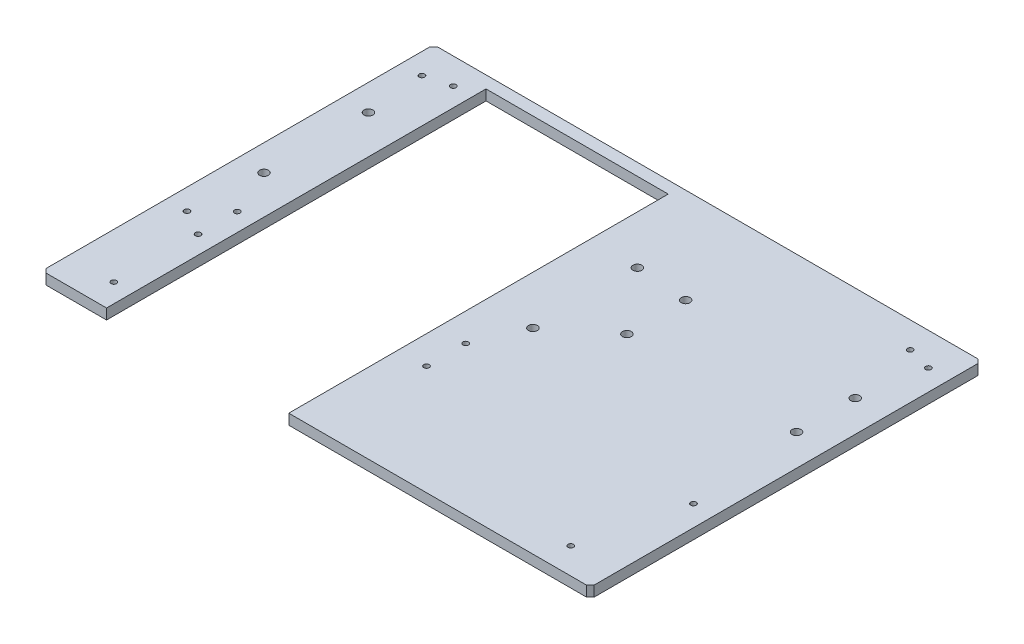
ISO-10303-21;
HEADER;
FILE_DESCRIPTION(('STEP AP214'),'2;1');
FILE_NAME('part.step','',(''),(''),'','','');
FILE_SCHEMA(('AUTOMOTIVE_DESIGN { 1 0 10303 214 1 1 1 1 }'));
ENDSEC;
DATA;
#1=APPLICATION_CONTEXT('core data for automotive mechanical design processes');
#2=APPLICATION_PROTOCOL_DEFINITION('international standard','automotive_design',2000,#1);
#3=PRODUCT_CONTEXT('',#1,'mechanical');
#4=PRODUCT('Part','Part','',(#3));
#5=PRODUCT_RELATED_PRODUCT_CATEGORY('part','',(#4));
#6=PRODUCT_DEFINITION_FORMATION('','',#4);
#7=PRODUCT_DEFINITION_CONTEXT('part definition',#1,'design');
#8=PRODUCT_DEFINITION('design','',#6,#7);
#9=PRODUCT_DEFINITION_SHAPE('','',#8);
#10=(LENGTH_UNIT() NAMED_UNIT(*) SI_UNIT(.MILLI.,.METRE.));
#11=(NAMED_UNIT(*) PLANE_ANGLE_UNIT() SI_UNIT($,.RADIAN.));
#12=(NAMED_UNIT(*) SI_UNIT($,.STERADIAN.) SOLID_ANGLE_UNIT());
#13=UNCERTAINTY_MEASURE_WITH_UNIT(LENGTH_MEASURE(1.E-05),#10,'distance_accuracy_value','');
#14=(GEOMETRIC_REPRESENTATION_CONTEXT(3) GLOBAL_UNCERTAINTY_ASSIGNED_CONTEXT((#13)) GLOBAL_UNIT_ASSIGNED_CONTEXT((#10,
#11,#12)) REPRESENTATION_CONTEXT('',''));
#15=CARTESIAN_POINT('',(0.,0.,0.));
#16=DIRECTION('',(0.,0.,1.));
#17=DIRECTION('',(1.,0.,0.));
#18=AXIS2_PLACEMENT_3D('',#15,#16,#17);
#19=CARTESIAN_POINT('',(-210.,4.,150.));
#20=DIRECTION('',(0.,0.,-1.));
#21=DIRECTION('',(-1.,0.,0.));
#22=AXIS2_PLACEMENT_3D('',#19,#20,#21);
#23=PLANE('',#22);
#24=DIRECTION('',(1.,0.,0.));
#25=VECTOR('',#24,1.);
#26=CARTESIAN_POINT('',(-210.,-4.,150.));
#27=LINE('',#26,#25);
#28=CARTESIAN_POINT('',(-207.,-4.,150.));
#29=VERTEX_POINT('',#28);
#30=CARTESIAN_POINT('',(-160.609555765265,-4.,150.));
#31=VERTEX_POINT('',#30);
#32=EDGE_CURVE('E305',#29,#31,#27,.T.);
#33=ORIENTED_EDGE('',*,*,#32,.T.);
#34=DIRECTION('',(0.,1.,0.));
#35=VECTOR('',#34,1.);
#36=CARTESIAN_POINT('',(-160.609555765265,4.,150.));
#37=LINE('',#36,#35);
#38=CARTESIAN_POINT('',(-160.609555765265,4.,150.));
#39=VERTEX_POINT('',#38);
#40=EDGE_CURVE('E156',#31,#39,#37,.T.);
#41=ORIENTED_EDGE('',*,*,#40,.T.);
#42=DIRECTION('',(1.,0.,0.));
#43=VECTOR('',#42,1.);
#44=CARTESIAN_POINT('',(-210.,4.,150.));
#45=LINE('',#44,#43);
#46=CARTESIAN_POINT('',(-207.,4.,150.));
#47=VERTEX_POINT('',#46);
#48=EDGE_CURVE('E313',#47,#39,#45,.T.);
#49=ORIENTED_EDGE('',*,*,#48,.F.);
#50=DIRECTION('',(0.,-1.,0.));
#51=VECTOR('',#50,1.);
#52=CARTESIAN_POINT('',(-207.,4.,150.));
#53=LINE('',#52,#51);
#54=EDGE_CURVE('E373',#47,#29,#53,.T.);
#55=ORIENTED_EDGE('',*,*,#54,.T.);
#56=EDGE_LOOP('',(#33,#41,#49,#55));
#57=FACE_BOUND('',#56,.T.);
#58=ADVANCED_FACE('F40',(#57),#23,.F.);
#59=CARTESIAN_POINT('',(210.,4.,150.));
#60=DIRECTION('',(-1.,0.,0.));
#61=DIRECTION('',(0.,0.,1.));
#62=AXIS2_PLACEMENT_3D('',#59,#60,#61);
#63=PLANE('',#62);
#64=DIRECTION('',(0.,0.,-1.));
#65=VECTOR('',#64,1.);
#66=CARTESIAN_POINT('',(210.,-4.,150.));
#67=LINE('',#66,#65);
#68=CARTESIAN_POINT('',(210.,-4.,147.));
#69=VERTEX_POINT('',#68);
#70=CARTESIAN_POINT('',(210.,-4.,-147.));
#71=VERTEX_POINT('',#70);
#72=EDGE_CURVE('E299',#69,#71,#67,.T.);
#73=ORIENTED_EDGE('',*,*,#72,.T.);
#74=DIRECTION('',(0.,1.,0.));
#75=VECTOR('',#74,1.);
#76=CARTESIAN_POINT('',(210.,4.,-147.));
#77=LINE('',#76,#75);
#78=CARTESIAN_POINT('',(210.,4.,-147.));
#79=VERTEX_POINT('',#78);
#80=EDGE_CURVE('E381',#71,#79,#77,.T.);
#81=ORIENTED_EDGE('',*,*,#80,.T.);
#82=DIRECTION('',(0.,0.,-1.));
#83=VECTOR('',#82,1.);
#84=CARTESIAN_POINT('',(210.,4.,150.));
#85=LINE('',#84,#83);
#86=CARTESIAN_POINT('',(210.,4.,147.));
#87=VERTEX_POINT('',#86);
#88=EDGE_CURVE('E300',#87,#79,#85,.T.);
#89=ORIENTED_EDGE('',*,*,#88,.F.);
#90=DIRECTION('',(0.,-1.,0.));
#91=VECTOR('',#90,1.);
#92=CARTESIAN_POINT('',(210.,4.,147.));
#93=LINE('',#92,#91);
#94=EDGE_CURVE('E377',#87,#69,#93,.T.);
#95=ORIENTED_EDGE('',*,*,#94,.T.);
#96=EDGE_LOOP('',(#73,#81,#89,#95));
#97=FACE_BOUND('',#96,.T.);
#98=ADVANCED_FACE('F425',(#97),#63,.F.);
#99=CARTESIAN_POINT('',(-210.,4.,-150.));
#100=DIRECTION('',(0.,0.,1.));
#101=DIRECTION('',(1.,0.,0.));
#102=AXIS2_PLACEMENT_3D('',#99,#100,#101);
#103=PLANE('',#102);
#104=DIRECTION('',(-1.,0.,0.));
#105=VECTOR('',#104,1.);
#106=CARTESIAN_POINT('',(-210.,-4.,-150.));
#107=LINE('',#106,#105);
#108=CARTESIAN_POINT('',(207.,-4.,-150.));
#109=VERTEX_POINT('',#108);
#110=CARTESIAN_POINT('',(-207.,-4.,-150.));
#111=VERTEX_POINT('',#110);
#112=EDGE_CURVE('E320',#109,#111,#107,.T.);
#113=ORIENTED_EDGE('',*,*,#112,.T.);
#114=DIRECTION('',(0.,1.,0.));
#115=VECTOR('',#114,1.);
#116=CARTESIAN_POINT('',(-207.,4.,-150.));
#117=LINE('',#116,#115);
#118=CARTESIAN_POINT('',(-207.,4.,-150.));
#119=VERTEX_POINT('',#118);
#120=EDGE_CURVE('E355',#111,#119,#117,.T.);
#121=ORIENTED_EDGE('',*,*,#120,.T.);
#122=DIRECTION('',(-1.,0.,0.));
#123=VECTOR('',#122,1.);
#124=CARTESIAN_POINT('',(-210.,4.,-150.));
#125=LINE('',#124,#123);
#126=CARTESIAN_POINT('',(207.,4.,-150.));
#127=VERTEX_POINT('',#126);
#128=EDGE_CURVE('E304',#127,#119,#125,.T.);
#129=ORIENTED_EDGE('',*,*,#128,.F.);
#130=DIRECTION('',(0.,-1.,0.));
#131=VECTOR('',#130,1.);
#132=CARTESIAN_POINT('',(207.,4.,-150.));
#133=LINE('',#132,#131);
#134=EDGE_CURVE('E351',#127,#109,#133,.T.);
#135=ORIENTED_EDGE('',*,*,#134,.T.);
#136=EDGE_LOOP('',(#113,#121,#129,#135));
#137=FACE_BOUND('',#136,.T.);
#138=ADVANCED_FACE('F433',(#137),#103,.F.);
#139=CARTESIAN_POINT('',(-210.,4.,150.));
#140=DIRECTION('',(1.,0.,0.));
#141=DIRECTION('',(0.,0.,-1.));
#142=AXIS2_PLACEMENT_3D('',#139,#140,#141);
#143=PLANE('',#142);
#144=DIRECTION('',(0.,0.,1.));
#145=VECTOR('',#144,1.);
#146=CARTESIAN_POINT('',(-210.,4.,150.));
#147=LINE('',#146,#145);
#148=CARTESIAN_POINT('',(-210.,4.,-147.));
#149=VERTEX_POINT('',#148);
#150=CARTESIAN_POINT('',(-210.,4.,147.));
#151=VERTEX_POINT('',#150);
#152=EDGE_CURVE('E309',#149,#151,#147,.T.);
#153=ORIENTED_EDGE('',*,*,#152,.F.);
#154=DIRECTION('',(0.,-1.,0.));
#155=VECTOR('',#154,1.);
#156=CARTESIAN_POINT('',(-210.,4.,-147.));
#157=LINE('',#156,#155);
#158=CARTESIAN_POINT('',(-210.,-4.,-147.));
#159=VERTEX_POINT('',#158);
#160=EDGE_CURVE('E334',#149,#159,#157,.T.);
#161=ORIENTED_EDGE('',*,*,#160,.T.);
#162=DIRECTION('',(0.,0.,1.));
#163=VECTOR('',#162,1.);
#164=CARTESIAN_POINT('',(-210.,-4.,150.));
#165=LINE('',#164,#163);
#166=CARTESIAN_POINT('',(-210.,-4.,147.));
#167=VERTEX_POINT('',#166);
#168=EDGE_CURVE('E324',#159,#167,#165,.T.);
#169=ORIENTED_EDGE('',*,*,#168,.T.);
#170=DIRECTION('',(0.,1.,0.));
#171=VECTOR('',#170,1.);
#172=CARTESIAN_POINT('',(-210.,4.,147.));
#173=LINE('',#172,#171);
#174=EDGE_CURVE('E316',#167,#151,#173,.T.);
#175=ORIENTED_EDGE('',*,*,#174,.T.);
#176=EDGE_LOOP('',(#153,#161,#169,#175));
#177=FACE_BOUND('',#176,.T.);
#178=ADVANCED_FACE('F442',(#177),#143,.F.);
#179=CARTESIAN_POINT('',(-21.0268777742826,4.,150.));
#180=VERTEX_POINT('',#179);
#181=CARTESIAN_POINT('',(207.,4.,150.));
#182=VERTEX_POINT('',#181);
#183=EDGE_CURVE('E64',#180,#182,#45,.T.);
#184=ORIENTED_EDGE('',*,*,#183,.F.);
#185=DIRECTION('',(0.,-1.,0.));
#186=VECTOR('',#185,1.);
#187=CARTESIAN_POINT('',(-21.0268777742826,4.,150.));
#188=LINE('',#187,#186);
#189=CARTESIAN_POINT('',(-21.0268777742826,-4.,150.));
#190=VERTEX_POINT('',#189);
#191=EDGE_CURVE('E142',#180,#190,#188,.T.);
#192=ORIENTED_EDGE('',*,*,#191,.T.);
#193=CARTESIAN_POINT('',(207.,-4.,150.));
#194=VERTEX_POINT('',#193);
#195=EDGE_CURVE('E328',#190,#194,#27,.T.);
#196=ORIENTED_EDGE('',*,*,#195,.T.);
#197=DIRECTION('',(0.,1.,0.));
#198=VECTOR('',#197,1.);
#199=CARTESIAN_POINT('',(207.,4.,150.));
#200=LINE('',#199,#198);
#201=EDGE_CURVE('E370',#194,#182,#200,.T.);
#202=ORIENTED_EDGE('',*,*,#201,.T.);
#203=EDGE_LOOP('',(#184,#192,#196,#202));
#204=FACE_BOUND('',#203,.T.);
#205=ADVANCED_FACE('F412',(#204),#23,.F.);
#206=CARTESIAN_POINT('',(210.,4.,-150.));
#207=DIRECTION('',(0.,-1.,0.));
#208=DIRECTION('',(0.,0.,-1.));
#209=AXIS2_PLACEMENT_3D('',#206,#207,#208);
#210=PLANE('',#209);
#211=CARTESIAN_POINT('',(-175.,4.,130.));
#212=DIRECTION('',(0.,1.,0.));
#213=DIRECTION('',(0.,0.,1.));
#214=AXIS2_PLACEMENT_3D('',#211,#212,#213);
#215=CIRCLE('',#214,2.09999999999999);
#216=CARTESIAN_POINT('',(-175.,4.,132.1));
#217=VERTEX_POINT('',#216);
#218=EDGE_CURVE('E160',#217,#217,#215,.T.);
#219=ORIENTED_EDGE('',*,*,#218,.F.);
#220=EDGE_LOOP('',(#219));
#221=FACE_BOUND('',#220,.T.);
#222=CARTESIAN_POINT('',(175.,4.,130.));
#223=DIRECTION('',(0.,1.,0.));
#224=DIRECTION('',(0.,0.,1.));
#225=AXIS2_PLACEMENT_3D('',#222,#223,#224);
#226=CIRCLE('',#225,2.09999999999999);
#227=CARTESIAN_POINT('',(175.,4.,132.1));
#228=VERTEX_POINT('',#227);
#229=EDGE_CURVE('E165',#228,#228,#226,.T.);
#230=ORIENTED_EDGE('',*,*,#229,.F.);
#231=EDGE_LOOP('',(#230));
#232=FACE_BOUND('',#231,.T.);
#233=CARTESIAN_POINT('',(175.,4.,-130.));
#234=DIRECTION('',(0.,1.,0.));
#235=DIRECTION('',(0.,0.,1.));
#236=AXIS2_PLACEMENT_3D('',#233,#234,#235);
#237=CIRCLE('',#236,2.09999999999999);
#238=CARTESIAN_POINT('',(175.,4.,-127.9));
#239=VERTEX_POINT('',#238);
#240=EDGE_CURVE('E173',#239,#239,#237,.T.);
#241=ORIENTED_EDGE('',*,*,#240,.F.);
#242=EDGE_LOOP('',(#241));
#243=FACE_BOUND('',#242,.T.);
#244=CARTESIAN_POINT('',(-175.,4.,-130.));
#245=DIRECTION('',(0.,1.,0.));
#246=DIRECTION('',(0.,0.,1.));
#247=AXIS2_PLACEMENT_3D('',#244,#245,#246);
#248=CIRCLE('',#247,2.09999999999999);
#249=CARTESIAN_POINT('',(-175.,4.,-127.9));
#250=VERTEX_POINT('',#249);
#251=EDGE_CURVE('E178',#250,#250,#248,.T.);
#252=ORIENTED_EDGE('',*,*,#251,.F.);
#253=EDGE_LOOP('',(#252));
#254=FACE_BOUND('',#253,.T.);
#255=CARTESIAN_POINT('',(-194.,4.,-125.));
#256=DIRECTION('',(0.,1.,0.));
#257=DIRECTION('',(0.,0.,1.));
#258=AXIS2_PLACEMENT_3D('',#255,#256,#257);
#259=CIRCLE('',#258,2.09999999999999);
#260=CARTESIAN_POINT('',(-194.,4.,-122.9));
#261=VERTEX_POINT('',#260);
#262=EDGE_CURVE('E183',#261,#261,#259,.T.);
#263=ORIENTED_EDGE('',*,*,#262,.F.);
#264=EDGE_LOOP('',(#263));
#265=FACE_BOUND('',#264,.T.);
#266=CARTESIAN_POINT('',(-194.,4.,54.9999999999999));
#267=DIRECTION('',(0.,1.,0.));
#268=DIRECTION('',(0.,0.,1.));
#269=AXIS2_PLACEMENT_3D('',#266,#267,#268);
#270=CIRCLE('',#269,2.09999999999999);
#271=CARTESIAN_POINT('',(-194.,4.,57.0999999999999));
#272=VERTEX_POINT('',#271);
#273=EDGE_CURVE('E191',#272,#272,#270,.T.);
#274=ORIENTED_EDGE('',*,*,#273,.F.);
#275=EDGE_LOOP('',(#274));
#276=FACE_BOUND('',#275,.T.);
#277=CARTESIAN_POINT('',(194.,4.,54.9999999999999));
#278=DIRECTION('',(0.,1.,0.));
#279=DIRECTION('',(0.,0.,1.));
#280=AXIS2_PLACEMENT_3D('',#277,#278,#279);
#281=CIRCLE('',#280,2.09999999999999);
#282=CARTESIAN_POINT('',(194.,4.,57.0999999999999));
#283=VERTEX_POINT('',#282);
#284=EDGE_CURVE('E196',#283,#283,#281,.T.);
#285=ORIENTED_EDGE('',*,*,#284,.F.);
#286=EDGE_LOOP('',(#285));
#287=FACE_BOUND('',#286,.T.);
#288=CARTESIAN_POINT('',(194.,4.,-125.));
#289=DIRECTION('',(0.,1.,0.));
#290=DIRECTION('',(0.,0.,1.));
#291=AXIS2_PLACEMENT_3D('',#288,#289,#290);
#292=CIRCLE('',#291,2.09999999999999);
#293=CARTESIAN_POINT('',(194.,4.,-122.9));
#294=VERTEX_POINT('',#293);
#295=EDGE_CURVE('E204',#294,#294,#292,.T.);
#296=ORIENTED_EDGE('',*,*,#295,.F.);
#297=EDGE_LOOP('',(#296));
#298=FACE_BOUND('',#297,.T.);
#299=CARTESIAN_POINT('',(-174.5,4.,66.0000000000001));
#300=DIRECTION('',(0.,1.,0.));
#301=DIRECTION('',(0.,0.,1.));
#302=AXIS2_PLACEMENT_3D('',#299,#300,#301);
#303=CIRCLE('',#302,2.09999999999999);
#304=CARTESIAN_POINT('',(-174.5,4.,68.1000000000001));
#305=VERTEX_POINT('',#304);
#306=EDGE_CURVE('E212',#305,#305,#303,.T.);
#307=ORIENTED_EDGE('',*,*,#306,.F.);
#308=EDGE_LOOP('',(#307));
#309=FACE_BOUND('',#308,.T.);
#310=CARTESIAN_POINT('',(-174.5,4.,36.0000000000001));
#311=DIRECTION('',(0.,1.,0.));
#312=DIRECTION('',(0.,0.,1.));
#313=AXIS2_PLACEMENT_3D('',#310,#311,#312);
#314=CIRCLE('',#313,2.09999999999999);
#315=CARTESIAN_POINT('',(-174.5,4.,38.1000000000001));
#316=VERTEX_POINT('',#315);
#317=EDGE_CURVE('E220',#316,#316,#314,.T.);
#318=ORIENTED_EDGE('',*,*,#317,.F.);
#319=EDGE_LOOP('',(#318));
#320=FACE_BOUND('',#319,.T.);
#321=CARTESIAN_POINT('',(0.499999999999751,4.,36.0000000000001));
#322=DIRECTION('',(0.,1.,0.));
#323=DIRECTION('',(0.,0.,1.));
#324=AXIS2_PLACEMENT_3D('',#321,#322,#323);
#325=CIRCLE('',#324,2.1);
#326=CARTESIAN_POINT('',(0.499999999999751,4.,38.1000000000001));
#327=VERTEX_POINT('',#326);
#328=EDGE_CURVE('E228',#327,#327,#325,.T.);
#329=ORIENTED_EDGE('',*,*,#328,.F.);
#330=EDGE_LOOP('',(#329));
#331=FACE_BOUND('',#330,.T.);
#332=CARTESIAN_POINT('',(0.499999999999862,4.,66.0000000000001));
#333=DIRECTION('',(0.,1.,0.));
#334=DIRECTION('',(0.,0.,1.));
#335=AXIS2_PLACEMENT_3D('',#332,#333,#334);
#336=CIRCLE('',#335,2.1);
#337=CARTESIAN_POINT('',(0.499999999999862,4.,68.1000000000001));
#338=VERTEX_POINT('',#337);
#339=EDGE_CURVE('E236',#338,#338,#336,.T.);
#340=ORIENTED_EDGE('',*,*,#339,.F.);
#341=EDGE_LOOP('',(#340));
#342=FACE_BOUND('',#341,.T.);
#343=CARTESIAN_POINT('',(-190.,4.,-80.0000000000001));
#344=DIRECTION('',(0.,1.,0.));
#345=DIRECTION('',(0.,0.,1.));
#346=AXIS2_PLACEMENT_3D('',#343,#344,#345);
#347=CIRCLE('',#346,3.39999999999999);
#348=CARTESIAN_POINT('',(-190.,4.,-76.6000000000001));
#349=VERTEX_POINT('',#348);
#350=EDGE_CURVE('E244',#349,#349,#347,.T.);
#351=ORIENTED_EDGE('',*,*,#350,.F.);
#352=EDGE_LOOP('',(#351));
#353=FACE_BOUND('',#352,.T.);
#354=CARTESIAN_POINT('',(15.9999999999998,4.,-80.0000000000001));
#355=DIRECTION('',(0.,1.,0.));
#356=DIRECTION('',(0.,0.,1.));
#357=AXIS2_PLACEMENT_3D('',#354,#355,#356);
#358=CIRCLE('',#357,3.39999999999999);
#359=CARTESIAN_POINT('',(15.9999999999998,4.,-76.6000000000001));
#360=VERTEX_POINT('',#359);
#361=EDGE_CURVE('E249',#360,#360,#358,.T.);
#362=ORIENTED_EDGE('',*,*,#361,.F.);
#363=EDGE_LOOP('',(#362));
#364=FACE_BOUND('',#363,.T.);
#365=CARTESIAN_POINT('',(16.0000000000001,4.,0.));
#366=DIRECTION('',(0.,1.,0.));
#367=DIRECTION('',(0.,0.,1.));
#368=AXIS2_PLACEMENT_3D('',#365,#366,#367);
#369=CIRCLE('',#368,3.39999999999999);
#370=CARTESIAN_POINT('',(16.0000000000001,4.,3.39999999999992));
#371=VERTEX_POINT('',#370);
#372=EDGE_CURVE('E254',#371,#371,#369,.T.);
#373=ORIENTED_EDGE('',*,*,#372,.F.);
#374=EDGE_LOOP('',(#373));
#375=FACE_BOUND('',#374,.T.);
#376=CARTESIAN_POINT('',(-190.,4.,0.));
#377=DIRECTION('',(0.,1.,0.));
#378=DIRECTION('',(0.,0.,1.));
#379=AXIS2_PLACEMENT_3D('',#376,#377,#378);
#380=CIRCLE('',#379,3.39999999999999);
#381=CARTESIAN_POINT('',(-190.,4.,3.39999999999992));
#382=VERTEX_POINT('',#381);
#383=EDGE_CURVE('E259',#382,#382,#380,.T.);
#384=ORIENTED_EDGE('',*,*,#383,.F.);
#385=EDGE_LOOP('',(#384));
#386=FACE_BOUND('',#385,.T.);
#387=CARTESIAN_POINT('',(56.,4.,-32.0000000000001));
#388=DIRECTION('',(0.,1.,0.));
#389=DIRECTION('',(0.,0.,1.));
#390=AXIS2_PLACEMENT_3D('',#387,#388,#389);
#391=CIRCLE('',#390,3.39999999999999);
#392=CARTESIAN_POINT('',(56.,4.,-28.6000000000001));
#393=VERTEX_POINT('',#392);
#394=EDGE_CURVE('E267',#393,#393,#391,.T.);
#395=ORIENTED_EDGE('',*,*,#394,.F.);
#396=EDGE_LOOP('',(#395));
#397=FACE_BOUND('',#396,.T.);
#398=CARTESIAN_POINT('',(186.,4.,-32.0000000000001));
#399=DIRECTION('',(0.,1.,0.));
#400=DIRECTION('',(0.,0.,1.));
#401=AXIS2_PLACEMENT_3D('',#398,#399,#400);
#402=CIRCLE('',#401,3.39999999999999);
#403=CARTESIAN_POINT('',(186.,4.,-28.6000000000001));
#404=VERTEX_POINT('',#403);
#405=EDGE_CURVE('E275',#404,#404,#402,.T.);
#406=ORIENTED_EDGE('',*,*,#405,.F.);
#407=EDGE_LOOP('',(#406));
#408=FACE_BOUND('',#407,.T.);
#409=CARTESIAN_POINT('',(186.,4.,-77.0000000000001));
#410=DIRECTION('',(0.,1.,0.));
#411=DIRECTION('',(0.,0.,1.));
#412=AXIS2_PLACEMENT_3D('',#409,#410,#411);
#413=CIRCLE('',#412,3.39999999999999);
#414=CARTESIAN_POINT('',(186.,4.,-73.6000000000001));
#415=VERTEX_POINT('',#414);
#416=EDGE_CURVE('E283',#415,#415,#413,.T.);
#417=ORIENTED_EDGE('',*,*,#416,.F.);
#418=EDGE_LOOP('',(#417));
#419=FACE_BOUND('',#418,.T.);
#420=CARTESIAN_POINT('',(56.,4.,-77.0000000000001));
#421=DIRECTION('',(0.,1.,0.));
#422=DIRECTION('',(0.,0.,1.));
#423=AXIS2_PLACEMENT_3D('',#420,#421,#422);
#424=CIRCLE('',#423,3.39999999999999);
#425=CARTESIAN_POINT('',(56.,4.,-73.6000000000001));
#426=VERTEX_POINT('',#425);
#427=EDGE_CURVE('E291',#426,#426,#424,.T.);
#428=ORIENTED_EDGE('',*,*,#427,.F.);
#429=EDGE_LOOP('',(#428));
#430=FACE_BOUND('',#429,.T.);
#431=ORIENTED_EDGE('',*,*,#48,.T.);
#432=DIRECTION('',(0.,0.,1.));
#433=VECTOR('',#432,1.);
#434=CARTESIAN_POINT('',(-160.609555765265,4.,-140.701128936423));
#435=LINE('',#434,#433);
#436=CARTESIAN_POINT('',(-160.609555765265,4.,-140.701128936423));
#437=VERTEX_POINT('',#436);
#438=EDGE_CURVE('E144',#437,#39,#435,.T.);
#439=ORIENTED_EDGE('',*,*,#438,.F.);
#440=DIRECTION('',(-1.,0.,0.));
#441=VECTOR('',#440,1.);
#442=CARTESIAN_POINT('',(-160.609555765265,4.,-140.701128936423));
#443=LINE('',#442,#441);
#444=CARTESIAN_POINT('',(-21.0268777742826,4.,-140.701128936423));
#445=VERTEX_POINT('',#444);
#446=EDGE_CURVE('E132',#445,#437,#443,.T.);
#447=ORIENTED_EDGE('',*,*,#446,.F.);
#448=DIRECTION('',(0.,0.,-1.));
#449=VECTOR('',#448,1.);
#450=CARTESIAN_POINT('',(-21.0268777742826,4.,-140.701128936423));
#451=LINE('',#450,#449);
#452=EDGE_CURVE('E139',#180,#445,#451,.T.);
#453=ORIENTED_EDGE('',*,*,#452,.F.);
#454=ORIENTED_EDGE('',*,*,#183,.T.);
#455=DIRECTION('',(-0.707106781186541,0.,0.707106781186554));
#456=VECTOR('',#455,1.);
#457=CARTESIAN_POINT('',(210.,4.,147.));
#458=LINE('',#457,#456);
#459=EDGE_CURVE('E358',#182,#87,#458,.F.);
#460=ORIENTED_EDGE('',*,*,#459,.T.);
#461=ORIENTED_EDGE('',*,*,#88,.T.);
#462=DIRECTION('',(0.707106781186554,0.,0.707106781186541));
#463=VECTOR('',#462,1.);
#464=CARTESIAN_POINT('',(207.,4.,-150.));
#465=LINE('',#464,#463);
#466=EDGE_CURVE('E361',#79,#127,#465,.F.);
#467=ORIENTED_EDGE('',*,*,#466,.T.);
#468=ORIENTED_EDGE('',*,*,#128,.T.);
#469=DIRECTION('',(0.707106781186541,0.,-0.707106781186554));
#470=VECTOR('',#469,1.);
#471=CARTESIAN_POINT('',(-210.,4.,-147.));
#472=LINE('',#471,#470);
#473=EDGE_CURVE('E367',#119,#149,#472,.F.);
#474=ORIENTED_EDGE('',*,*,#473,.T.);
#475=ORIENTED_EDGE('',*,*,#152,.T.);
#476=DIRECTION('',(-0.707106781186554,0.,-0.707106781186541));
#477=VECTOR('',#476,1.);
#478=CARTESIAN_POINT('',(-207.,4.,150.));
#479=LINE('',#478,#477);
#480=EDGE_CURVE('E364',#151,#47,#479,.F.);
#481=ORIENTED_EDGE('',*,*,#480,.T.);
#482=EDGE_LOOP('',(#431,#439,#447,#453,#454,#460,#461,#467,#468,#474,#475,#481));
#483=FACE_BOUND('',#482,.T.);
#484=ADVANCED_FACE('F147',(#221,#232,#243,#254,#265,#276,#287,#298,#309,#320,#331,#342,#353,
#364,#375,#386,#397,#408,#419,#430,#483),#210,.F.);
#485=CARTESIAN_POINT('',(210.,-4.,-150.));
#486=DIRECTION('',(0.,-1.,0.));
#487=DIRECTION('',(0.,0.,-1.));
#488=AXIS2_PLACEMENT_3D('',#485,#486,#487);
#489=PLANE('',#488);
#490=DIRECTION('',(0.,0.,-1.));
#491=VECTOR('',#490,1.);
#492=CARTESIAN_POINT('',(-160.609555765265,-4.,-150.));
#493=LINE('',#492,#491);
#494=CARTESIAN_POINT('',(-160.609555765265,-4.,-140.701128936423));
#495=VERTEX_POINT('',#494);
#496=EDGE_CURVE('E11',#31,#495,#493,.T.);
#497=ORIENTED_EDGE('',*,*,#496,.F.);
#498=ORIENTED_EDGE('',*,*,#32,.F.);
#499=DIRECTION('',(0.707106781186554,0.,0.707106781186541));
#500=VECTOR('',#499,1.);
#501=CARTESIAN_POINT('',(-148.499999999996,-4.,208.500000000003));
#502=LINE('',#501,#500);
#503=EDGE_CURVE('E345',#29,#167,#502,.F.);
#504=ORIENTED_EDGE('',*,*,#503,.T.);
#505=ORIENTED_EDGE('',*,*,#168,.F.);
#506=DIRECTION('',(-0.707106781186541,0.,0.707106781186554));
#507=VECTOR('',#506,1.);
#508=CARTESIAN_POINT('',(1.49999999999609,-4.,-358.5));
#509=LINE('',#508,#507);
#510=EDGE_CURVE('E348',#159,#111,#509,.F.);
#511=ORIENTED_EDGE('',*,*,#510,.T.);
#512=ORIENTED_EDGE('',*,*,#112,.F.);
#513=DIRECTION('',(-0.707106781186554,0.,-0.707106781186541));
#514=VECTOR('',#513,1.);
#515=CARTESIAN_POINT('',(208.5,-4.,-148.5));
#516=LINE('',#515,#514);
#517=EDGE_CURVE('E342',#109,#71,#516,.F.);
#518=ORIENTED_EDGE('',*,*,#517,.T.);
#519=ORIENTED_EDGE('',*,*,#72,.F.);
#520=DIRECTION('',(0.707106781186541,0.,-0.707106781186554));
#521=VECTOR('',#520,1.);
#522=CARTESIAN_POINT('',(358.5,-4.,-1.50000000000278));
#523=LINE('',#522,#521);
#524=EDGE_CURVE('E338',#69,#194,#523,.F.);
#525=ORIENTED_EDGE('',*,*,#524,.T.);
#526=ORIENTED_EDGE('',*,*,#195,.F.);
#527=DIRECTION('',(0.,0.,1.));
#528=VECTOR('',#527,1.);
#529=CARTESIAN_POINT('',(-21.0268777742826,-4.,-150.));
#530=LINE('',#529,#528);
#531=CARTESIAN_POINT('',(-21.0268777742826,-4.,-140.701128936423));
#532=VERTEX_POINT('',#531);
#533=EDGE_CURVE('E384',#532,#190,#530,.T.);
#534=ORIENTED_EDGE('',*,*,#533,.F.);
#535=DIRECTION('',(1.,0.,0.));
#536=VECTOR('',#535,1.);
#537=CARTESIAN_POINT('',(210.,-4.,-140.701128936423));
#538=LINE('',#537,#536);
#539=EDGE_CURVE('E49',#495,#532,#538,.T.);
#540=ORIENTED_EDGE('',*,*,#539,.F.);
#541=EDGE_LOOP('',(#497,#498,#504,#505,#511,#512,#518,#519,#525,#526,#534,#540));
#542=FACE_BOUND('',#541,.T.);
#543=CARTESIAN_POINT('',(-175.,-4.,130.));
#544=DIRECTION('',(0.,-1.,0.));
#545=DIRECTION('',(0.,0.,-1.));
#546=AXIS2_PLACEMENT_3D('',#543,#544,#545);
#547=CIRCLE('',#546,2.09999999999999);
#548=CARTESIAN_POINT('',(-175.,-4.,127.9));
#549=VERTEX_POINT('',#548);
#550=EDGE_CURVE('E164',#549,#549,#547,.T.);
#551=ORIENTED_EDGE('',*,*,#550,.F.);
#552=EDGE_LOOP('',(#551));
#553=FACE_BOUND('',#552,.T.);
#554=CARTESIAN_POINT('',(175.,-4.,130.));
#555=DIRECTION('',(0.,-1.,0.));
#556=DIRECTION('',(0.,0.,-1.));
#557=AXIS2_PLACEMENT_3D('',#554,#555,#556);
#558=CIRCLE('',#557,2.09999999999999);
#559=CARTESIAN_POINT('',(175.,-4.,127.9));
#560=VERTEX_POINT('',#559);
#561=EDGE_CURVE('E169',#560,#560,#558,.T.);
#562=ORIENTED_EDGE('',*,*,#561,.F.);
#563=EDGE_LOOP('',(#562));
#564=FACE_BOUND('',#563,.T.);
#565=CARTESIAN_POINT('',(175.,-4.,-130.));
#566=DIRECTION('',(0.,-1.,0.));
#567=DIRECTION('',(0.,0.,-1.));
#568=AXIS2_PLACEMENT_3D('',#565,#566,#567);
#569=CIRCLE('',#568,2.09999999999999);
#570=CARTESIAN_POINT('',(175.,-4.,-132.1));
#571=VERTEX_POINT('',#570);
#572=EDGE_CURVE('E177',#571,#571,#569,.T.);
#573=ORIENTED_EDGE('',*,*,#572,.F.);
#574=EDGE_LOOP('',(#573));
#575=FACE_BOUND('',#574,.T.);
#576=CARTESIAN_POINT('',(-175.,-4.,-130.));
#577=DIRECTION('',(0.,-1.,0.));
#578=DIRECTION('',(0.,0.,-1.));
#579=AXIS2_PLACEMENT_3D('',#576,#577,#578);
#580=CIRCLE('',#579,2.09999999999999);
#581=CARTESIAN_POINT('',(-175.,-4.,-132.1));
#582=VERTEX_POINT('',#581);
#583=EDGE_CURVE('E182',#582,#582,#580,.T.);
#584=ORIENTED_EDGE('',*,*,#583,.F.);
#585=EDGE_LOOP('',(#584));
#586=FACE_BOUND('',#585,.T.);
#587=CARTESIAN_POINT('',(-194.,-4.,-125.));
#588=DIRECTION('',(0.,-1.,0.));
#589=DIRECTION('',(0.,0.,-1.));
#590=AXIS2_PLACEMENT_3D('',#587,#588,#589);
#591=CIRCLE('',#590,2.09999999999999);
#592=CARTESIAN_POINT('',(-194.,-4.,-127.1));
#593=VERTEX_POINT('',#592);
#594=EDGE_CURVE('E187',#593,#593,#591,.T.);
#595=ORIENTED_EDGE('',*,*,#594,.F.);
#596=EDGE_LOOP('',(#595));
#597=FACE_BOUND('',#596,.T.);
#598=CARTESIAN_POINT('',(-194.,-4.,54.9999999999999));
#599=DIRECTION('',(0.,-1.,0.));
#600=DIRECTION('',(0.,0.,-1.));
#601=AXIS2_PLACEMENT_3D('',#598,#599,#600);
#602=CIRCLE('',#601,2.09999999999999);
#603=CARTESIAN_POINT('',(-194.,-4.,52.8999999999999));
#604=VERTEX_POINT('',#603);
#605=EDGE_CURVE('E195',#604,#604,#602,.T.);
#606=ORIENTED_EDGE('',*,*,#605,.F.);
#607=EDGE_LOOP('',(#606));
#608=FACE_BOUND('',#607,.T.);
#609=CARTESIAN_POINT('',(194.,-4.,54.9999999999999));
#610=DIRECTION('',(0.,-1.,0.));
#611=DIRECTION('',(0.,0.,-1.));
#612=AXIS2_PLACEMENT_3D('',#609,#610,#611);
#613=CIRCLE('',#612,2.09999999999999);
#614=CARTESIAN_POINT('',(194.,-4.,52.8999999999999));
#615=VERTEX_POINT('',#614);
#616=EDGE_CURVE('E200',#615,#615,#613,.T.);
#617=ORIENTED_EDGE('',*,*,#616,.F.);
#618=EDGE_LOOP('',(#617));
#619=FACE_BOUND('',#618,.T.);
#620=CARTESIAN_POINT('',(194.,-4.,-125.));
#621=DIRECTION('',(0.,-1.,0.));
#622=DIRECTION('',(0.,0.,-1.));
#623=AXIS2_PLACEMENT_3D('',#620,#621,#622);
#624=CIRCLE('',#623,2.09999999999999);
#625=CARTESIAN_POINT('',(194.,-4.,-127.1));
#626=VERTEX_POINT('',#625);
#627=EDGE_CURVE('E208',#626,#626,#624,.T.);
#628=ORIENTED_EDGE('',*,*,#627,.F.);
#629=EDGE_LOOP('',(#628));
#630=FACE_BOUND('',#629,.T.);
#631=CARTESIAN_POINT('',(-174.5,-4.,66.0000000000001));
#632=DIRECTION('',(0.,-1.,0.));
#633=DIRECTION('',(0.,0.,-1.));
#634=AXIS2_PLACEMENT_3D('',#631,#632,#633);
#635=CIRCLE('',#634,2.09999999999999);
#636=CARTESIAN_POINT('',(-174.5,-4.,63.9000000000001));
#637=VERTEX_POINT('',#636);
#638=EDGE_CURVE('E216',#637,#637,#635,.T.);
#639=ORIENTED_EDGE('',*,*,#638,.F.);
#640=EDGE_LOOP('',(#639));
#641=FACE_BOUND('',#640,.T.);
#642=CARTESIAN_POINT('',(-174.5,-4.,36.0000000000001));
#643=DIRECTION('',(0.,-1.,0.));
#644=DIRECTION('',(0.,0.,-1.));
#645=AXIS2_PLACEMENT_3D('',#642,#643,#644);
#646=CIRCLE('',#645,2.09999999999999);
#647=CARTESIAN_POINT('',(-174.5,-4.,33.9000000000001));
#648=VERTEX_POINT('',#647);
#649=EDGE_CURVE('E224',#648,#648,#646,.T.);
#650=ORIENTED_EDGE('',*,*,#649,.F.);
#651=EDGE_LOOP('',(#650));
#652=FACE_BOUND('',#651,.T.);
#653=CARTESIAN_POINT('',(0.499999999999751,-4.,36.0000000000001));
#654=DIRECTION('',(0.,-1.,0.));
#655=DIRECTION('',(0.,0.,-1.));
#656=AXIS2_PLACEMENT_3D('',#653,#654,#655);
#657=CIRCLE('',#656,2.1);
#658=CARTESIAN_POINT('',(0.499999999999751,-4.,33.9000000000001));
#659=VERTEX_POINT('',#658);
#660=EDGE_CURVE('E232',#659,#659,#657,.T.);
#661=ORIENTED_EDGE('',*,*,#660,.F.);
#662=EDGE_LOOP('',(#661));
#663=FACE_BOUND('',#662,.T.);
#664=CARTESIAN_POINT('',(0.499999999999862,-4.,66.0000000000001));
#665=DIRECTION('',(0.,-1.,0.));
#666=DIRECTION('',(0.,0.,-1.));
#667=AXIS2_PLACEMENT_3D('',#664,#665,#666);
#668=CIRCLE('',#667,2.1);
#669=CARTESIAN_POINT('',(0.499999999999862,-4.,63.9000000000001));
#670=VERTEX_POINT('',#669);
#671=EDGE_CURVE('E240',#670,#670,#668,.T.);
#672=ORIENTED_EDGE('',*,*,#671,.F.);
#673=EDGE_LOOP('',(#672));
#674=FACE_BOUND('',#673,.T.);
#675=CARTESIAN_POINT('',(-190.,-4.,-80.0000000000001));
#676=DIRECTION('',(0.,-1.,0.));
#677=DIRECTION('',(0.,0.,-1.));
#678=AXIS2_PLACEMENT_3D('',#675,#676,#677);
#679=CIRCLE('',#678,3.39999999999999);
#680=CARTESIAN_POINT('',(-190.,-4.,-83.4000000000001));
#681=VERTEX_POINT('',#680);
#682=EDGE_CURVE('E248',#681,#681,#679,.T.);
#683=ORIENTED_EDGE('',*,*,#682,.F.);
#684=EDGE_LOOP('',(#683));
#685=FACE_BOUND('',#684,.T.);
#686=CARTESIAN_POINT('',(15.9999999999998,-4.,-80.0000000000001));
#687=DIRECTION('',(0.,-1.,0.));
#688=DIRECTION('',(0.,0.,-1.));
#689=AXIS2_PLACEMENT_3D('',#686,#687,#688);
#690=CIRCLE('',#689,3.39999999999999);
#691=CARTESIAN_POINT('',(15.9999999999998,-4.,-83.4000000000001));
#692=VERTEX_POINT('',#691);
#693=EDGE_CURVE('E253',#692,#692,#690,.T.);
#694=ORIENTED_EDGE('',*,*,#693,.F.);
#695=EDGE_LOOP('',(#694));
#696=FACE_BOUND('',#695,.T.);
#697=CARTESIAN_POINT('',(16.0000000000001,-4.,0.));
#698=DIRECTION('',(0.,-1.,0.));
#699=DIRECTION('',(0.,0.,-1.));
#700=AXIS2_PLACEMENT_3D('',#697,#698,#699);
#701=CIRCLE('',#700,3.39999999999999);
#702=CARTESIAN_POINT('',(16.0000000000001,-4.,-3.40000000000006));
#703=VERTEX_POINT('',#702);
#704=EDGE_CURVE('E258',#703,#703,#701,.T.);
#705=ORIENTED_EDGE('',*,*,#704,.F.);
#706=EDGE_LOOP('',(#705));
#707=FACE_BOUND('',#706,.T.);
#708=CARTESIAN_POINT('',(-190.,-4.,0.));
#709=DIRECTION('',(0.,-1.,0.));
#710=DIRECTION('',(0.,0.,-1.));
#711=AXIS2_PLACEMENT_3D('',#708,#709,#710);
#712=CIRCLE('',#711,3.39999999999999);
#713=CARTESIAN_POINT('',(-190.,-4.,-3.40000000000006));
#714=VERTEX_POINT('',#713);
#715=EDGE_CURVE('E263',#714,#714,#712,.T.);
#716=ORIENTED_EDGE('',*,*,#715,.F.);
#717=EDGE_LOOP('',(#716));
#718=FACE_BOUND('',#717,.T.);
#719=CARTESIAN_POINT('',(56.,-4.,-32.0000000000001));
#720=DIRECTION('',(0.,-1.,0.));
#721=DIRECTION('',(0.,0.,-1.));
#722=AXIS2_PLACEMENT_3D('',#719,#720,#721);
#723=CIRCLE('',#722,3.39999999999999);
#724=CARTESIAN_POINT('',(56.,-4.,-35.4000000000001));
#725=VERTEX_POINT('',#724);
#726=EDGE_CURVE('E271',#725,#725,#723,.T.);
#727=ORIENTED_EDGE('',*,*,#726,.F.);
#728=EDGE_LOOP('',(#727));
#729=FACE_BOUND('',#728,.T.);
#730=CARTESIAN_POINT('',(186.,-4.,-32.0000000000001));
#731=DIRECTION('',(0.,-1.,0.));
#732=DIRECTION('',(0.,0.,-1.));
#733=AXIS2_PLACEMENT_3D('',#730,#731,#732);
#734=CIRCLE('',#733,3.39999999999999);
#735=CARTESIAN_POINT('',(186.,-4.,-35.4000000000001));
#736=VERTEX_POINT('',#735);
#737=EDGE_CURVE('E279',#736,#736,#734,.T.);
#738=ORIENTED_EDGE('',*,*,#737,.F.);
#739=EDGE_LOOP('',(#738));
#740=FACE_BOUND('',#739,.T.);
#741=CARTESIAN_POINT('',(186.,-4.,-77.0000000000001));
#742=DIRECTION('',(0.,-1.,0.));
#743=DIRECTION('',(0.,0.,-1.));
#744=AXIS2_PLACEMENT_3D('',#741,#742,#743);
#745=CIRCLE('',#744,3.39999999999999);
#746=CARTESIAN_POINT('',(186.,-4.,-80.4000000000001));
#747=VERTEX_POINT('',#746);
#748=EDGE_CURVE('E287',#747,#747,#745,.T.);
#749=ORIENTED_EDGE('',*,*,#748,.F.);
#750=EDGE_LOOP('',(#749));
#751=FACE_BOUND('',#750,.T.);
#752=CARTESIAN_POINT('',(56.,-4.,-77.0000000000001));
#753=DIRECTION('',(0.,-1.,0.));
#754=DIRECTION('',(0.,0.,-1.));
#755=AXIS2_PLACEMENT_3D('',#752,#753,#754);
#756=CIRCLE('',#755,3.39999999999999);
#757=CARTESIAN_POINT('',(56.,-4.,-80.4000000000001));
#758=VERTEX_POINT('',#757);
#759=EDGE_CURVE('E295',#758,#758,#756,.T.);
#760=ORIENTED_EDGE('',*,*,#759,.F.);
#761=EDGE_LOOP('',(#760));
#762=FACE_BOUND('',#761,.T.);
#763=ADVANCED_FACE('F418',(#542,#553,#564,#575,#586,#597,#608,#619,#630,#641,#652,#663,#674,
#685,#696,#707,#718,#729,#740,#751,#762),#489,.T.);
#764=CARTESIAN_POINT('',(-210.,4.,-147.));
#765=DIRECTION('',(0.707106781186554,0.,0.707106781186541));
#766=DIRECTION('',(0.707106781186541,0.,-0.707106781186554));
#767=AXIS2_PLACEMENT_3D('',#764,#765,#766);
#768=PLANE('',#767);
#769=ORIENTED_EDGE('',*,*,#473,.F.);
#770=ORIENTED_EDGE('',*,*,#120,.F.);
#771=ORIENTED_EDGE('',*,*,#510,.F.);
#772=ORIENTED_EDGE('',*,*,#160,.F.);
#773=EDGE_LOOP('',(#769,#770,#771,#772));
#774=FACE_BOUND('',#773,.T.);
#775=ADVANCED_FACE('F437',(#774),#768,.F.);
#776=CARTESIAN_POINT('',(-207.,4.,150.));
#777=DIRECTION('',(0.707106781186541,0.,-0.707106781186554));
#778=DIRECTION('',(-0.707106781186554,0.,-0.707106781186541));
#779=AXIS2_PLACEMENT_3D('',#776,#777,#778);
#780=PLANE('',#779);
#781=ORIENTED_EDGE('',*,*,#480,.F.);
#782=ORIENTED_EDGE('',*,*,#174,.F.);
#783=ORIENTED_EDGE('',*,*,#503,.F.);
#784=ORIENTED_EDGE('',*,*,#54,.F.);
#785=EDGE_LOOP('',(#781,#782,#783,#784));
#786=FACE_BOUND('',#785,.T.);
#787=ADVANCED_FACE('F446',(#786),#780,.F.);
#788=CARTESIAN_POINT('',(207.,4.,-150.));
#789=DIRECTION('',(-0.707106781186541,0.,0.707106781186554));
#790=DIRECTION('',(0.707106781186554,0.,0.707106781186541));
#791=AXIS2_PLACEMENT_3D('',#788,#789,#790);
#792=PLANE('',#791);
#793=ORIENTED_EDGE('',*,*,#466,.F.);
#794=ORIENTED_EDGE('',*,*,#80,.F.);
#795=ORIENTED_EDGE('',*,*,#517,.F.);
#796=ORIENTED_EDGE('',*,*,#134,.F.);
#797=EDGE_LOOP('',(#793,#794,#795,#796));
#798=FACE_BOUND('',#797,.T.);
#799=ADVANCED_FACE('F428',(#798),#792,.F.);
#800=CARTESIAN_POINT('',(210.,4.,147.));
#801=DIRECTION('',(-0.707106781186554,0.,-0.707106781186541));
#802=DIRECTION('',(-0.707106781186541,0.,0.707106781186554));
#803=AXIS2_PLACEMENT_3D('',#800,#801,#802);
#804=PLANE('',#803);
#805=ORIENTED_EDGE('',*,*,#459,.F.);
#806=ORIENTED_EDGE('',*,*,#201,.F.);
#807=ORIENTED_EDGE('',*,*,#524,.F.);
#808=ORIENTED_EDGE('',*,*,#94,.F.);
#809=EDGE_LOOP('',(#805,#806,#807,#808));
#810=FACE_BOUND('',#809,.T.);
#811=ADVANCED_FACE('F42',(#810),#804,.F.);
#812=CARTESIAN_POINT('',(56.,4.,-77.0000000000001));
#813=DIRECTION('',(0.,1.,0.));
#814=DIRECTION('',(0.,0.,1.));
#815=AXIS2_PLACEMENT_3D('',#812,#813,#814);
#816=CYLINDRICAL_SURFACE('',#815,3.39999999999999);
#817=ORIENTED_EDGE('',*,*,#759,.T.);
#818=EDGE_LOOP('',(#817));
#819=FACE_BOUND('',#818,.T.);
#820=ORIENTED_EDGE('',*,*,#427,.T.);
#821=EDGE_LOOP('',(#820));
#822=FACE_BOUND('',#821,.T.);
#823=ADVANCED_FACE('F494',(#819,#822),#816,.F.);
#824=CARTESIAN_POINT('',(186.,4.,-77.0000000000001));
#825=DIRECTION('',(0.,1.,0.));
#826=DIRECTION('',(0.,0.,1.));
#827=AXIS2_PLACEMENT_3D('',#824,#825,#826);
#828=CYLINDRICAL_SURFACE('',#827,3.39999999999999);
#829=ORIENTED_EDGE('',*,*,#748,.T.);
#830=EDGE_LOOP('',(#829));
#831=FACE_BOUND('',#830,.T.);
#832=ORIENTED_EDGE('',*,*,#416,.T.);
#833=EDGE_LOOP('',(#832));
#834=FACE_BOUND('',#833,.T.);
#835=ADVANCED_FACE('F498',(#831,#834),#828,.F.);
#836=CARTESIAN_POINT('',(186.,4.,-32.0000000000001));
#837=DIRECTION('',(0.,1.,0.));
#838=DIRECTION('',(0.,0.,1.));
#839=AXIS2_PLACEMENT_3D('',#836,#837,#838);
#840=CYLINDRICAL_SURFACE('',#839,3.39999999999999);
#841=ORIENTED_EDGE('',*,*,#737,.T.);
#842=EDGE_LOOP('',(#841));
#843=FACE_BOUND('',#842,.T.);
#844=ORIENTED_EDGE('',*,*,#405,.T.);
#845=EDGE_LOOP('',(#844));
#846=FACE_BOUND('',#845,.T.);
#847=ADVANCED_FACE('F504',(#843,#846),#840,.F.);
#848=CARTESIAN_POINT('',(56.,4.,-32.0000000000001));
#849=DIRECTION('',(0.,1.,0.));
#850=DIRECTION('',(0.,0.,1.));
#851=AXIS2_PLACEMENT_3D('',#848,#849,#850);
#852=CYLINDRICAL_SURFACE('',#851,3.39999999999999);
#853=ORIENTED_EDGE('',*,*,#726,.T.);
#854=EDGE_LOOP('',(#853));
#855=FACE_BOUND('',#854,.T.);
#856=ORIENTED_EDGE('',*,*,#394,.T.);
#857=EDGE_LOOP('',(#856));
#858=FACE_BOUND('',#857,.T.);
#859=ADVANCED_FACE('F688',(#855,#858),#852,.F.);
#860=CARTESIAN_POINT('',(-190.,4.,0.));
#861=DIRECTION('',(0.,1.,0.));
#862=DIRECTION('',(0.,0.,1.));
#863=AXIS2_PLACEMENT_3D('',#860,#861,#862);
#864=CYLINDRICAL_SURFACE('',#863,3.39999999999999);
#865=ORIENTED_EDGE('',*,*,#715,.T.);
#866=EDGE_LOOP('',(#865));
#867=FACE_BOUND('',#866,.T.);
#868=ORIENTED_EDGE('',*,*,#383,.T.);
#869=EDGE_LOOP('',(#868));
#870=FACE_BOUND('',#869,.T.);
#871=ADVANCED_FACE('F678',(#867,#870),#864,.F.);
#872=CARTESIAN_POINT('',(16.0000000000001,4.,0.));
#873=DIRECTION('',(0.,1.,0.));
#874=DIRECTION('',(0.,0.,1.));
#875=AXIS2_PLACEMENT_3D('',#872,#873,#874);
#876=CYLINDRICAL_SURFACE('',#875,3.39999999999999);
#877=ORIENTED_EDGE('',*,*,#704,.T.);
#878=EDGE_LOOP('',(#877));
#879=FACE_BOUND('',#878,.T.);
#880=ORIENTED_EDGE('',*,*,#372,.T.);
#881=EDGE_LOOP('',(#880));
#882=FACE_BOUND('',#881,.T.);
#883=ADVANCED_FACE('F668',(#879,#882),#876,.F.);
#884=CARTESIAN_POINT('',(15.9999999999998,4.,-80.0000000000001));
#885=DIRECTION('',(0.,1.,0.));
#886=DIRECTION('',(0.,0.,1.));
#887=AXIS2_PLACEMENT_3D('',#884,#885,#886);
#888=CYLINDRICAL_SURFACE('',#887,3.39999999999999);
#889=ORIENTED_EDGE('',*,*,#693,.T.);
#890=EDGE_LOOP('',(#889));
#891=FACE_BOUND('',#890,.T.);
#892=ORIENTED_EDGE('',*,*,#361,.T.);
#893=EDGE_LOOP('',(#892));
#894=FACE_BOUND('',#893,.T.);
#895=ADVANCED_FACE('F658',(#891,#894),#888,.F.);
#896=CARTESIAN_POINT('',(-190.,4.,-80.0000000000001));
#897=DIRECTION('',(0.,1.,0.));
#898=DIRECTION('',(0.,0.,1.));
#899=AXIS2_PLACEMENT_3D('',#896,#897,#898);
#900=CYLINDRICAL_SURFACE('',#899,3.39999999999999);
#901=ORIENTED_EDGE('',*,*,#682,.T.);
#902=EDGE_LOOP('',(#901));
#903=FACE_BOUND('',#902,.T.);
#904=ORIENTED_EDGE('',*,*,#350,.T.);
#905=EDGE_LOOP('',(#904));
#906=FACE_BOUND('',#905,.T.);
#907=ADVANCED_FACE('F648',(#903,#906),#900,.F.);
#908=CARTESIAN_POINT('',(0.499999999999862,4.,66.0000000000001));
#909=DIRECTION('',(0.,1.,0.));
#910=DIRECTION('',(0.,0.,1.));
#911=AXIS2_PLACEMENT_3D('',#908,#909,#910);
#912=CYLINDRICAL_SURFACE('',#911,2.1);
#913=ORIENTED_EDGE('',*,*,#671,.T.);
#914=EDGE_LOOP('',(#913));
#915=FACE_BOUND('',#914,.T.);
#916=ORIENTED_EDGE('',*,*,#339,.T.);
#917=EDGE_LOOP('',(#916));
#918=FACE_BOUND('',#917,.T.);
#919=ADVANCED_FACE('F638',(#915,#918),#912,.F.);
#920=CARTESIAN_POINT('',(0.499999999999751,4.,36.0000000000001));
#921=DIRECTION('',(0.,1.,0.));
#922=DIRECTION('',(0.,0.,1.));
#923=AXIS2_PLACEMENT_3D('',#920,#921,#922);
#924=CYLINDRICAL_SURFACE('',#923,2.1);
#925=ORIENTED_EDGE('',*,*,#660,.T.);
#926=EDGE_LOOP('',(#925));
#927=FACE_BOUND('',#926,.T.);
#928=ORIENTED_EDGE('',*,*,#328,.T.);
#929=EDGE_LOOP('',(#928));
#930=FACE_BOUND('',#929,.T.);
#931=ADVANCED_FACE('F628',(#927,#930),#924,.F.);
#932=CARTESIAN_POINT('',(-174.5,4.,36.0000000000001));
#933=DIRECTION('',(0.,1.,0.));
#934=DIRECTION('',(0.,0.,1.));
#935=AXIS2_PLACEMENT_3D('',#932,#933,#934);
#936=CYLINDRICAL_SURFACE('',#935,2.09999999999999);
#937=ORIENTED_EDGE('',*,*,#649,.T.);
#938=EDGE_LOOP('',(#937));
#939=FACE_BOUND('',#938,.T.);
#940=ORIENTED_EDGE('',*,*,#317,.T.);
#941=EDGE_LOOP('',(#940));
#942=FACE_BOUND('',#941,.T.);
#943=ADVANCED_FACE('F618',(#939,#942),#936,.F.);
#944=CARTESIAN_POINT('',(-174.5,4.,66.0000000000001));
#945=DIRECTION('',(0.,1.,0.));
#946=DIRECTION('',(0.,0.,1.));
#947=AXIS2_PLACEMENT_3D('',#944,#945,#946);
#948=CYLINDRICAL_SURFACE('',#947,2.09999999999999);
#949=ORIENTED_EDGE('',*,*,#638,.T.);
#950=EDGE_LOOP('',(#949));
#951=FACE_BOUND('',#950,.T.);
#952=ORIENTED_EDGE('',*,*,#306,.T.);
#953=EDGE_LOOP('',(#952));
#954=FACE_BOUND('',#953,.T.);
#955=ADVANCED_FACE('F608',(#951,#954),#948,.F.);
#956=CARTESIAN_POINT('',(194.,4.,-125.));
#957=DIRECTION('',(0.,1.,0.));
#958=DIRECTION('',(0.,0.,1.));
#959=AXIS2_PLACEMENT_3D('',#956,#957,#958);
#960=CYLINDRICAL_SURFACE('',#959,2.09999999999999);
#961=ORIENTED_EDGE('',*,*,#627,.T.);
#962=EDGE_LOOP('',(#961));
#963=FACE_BOUND('',#962,.T.);
#964=ORIENTED_EDGE('',*,*,#295,.T.);
#965=EDGE_LOOP('',(#964));
#966=FACE_BOUND('',#965,.T.);
#967=ADVANCED_FACE('F598',(#963,#966),#960,.F.);
#968=CARTESIAN_POINT('',(194.,4.,54.9999999999999));
#969=DIRECTION('',(0.,1.,0.));
#970=DIRECTION('',(0.,0.,1.));
#971=AXIS2_PLACEMENT_3D('',#968,#969,#970);
#972=CYLINDRICAL_SURFACE('',#971,2.09999999999999);
#973=ORIENTED_EDGE('',*,*,#616,.T.);
#974=EDGE_LOOP('',(#973));
#975=FACE_BOUND('',#974,.T.);
#976=ORIENTED_EDGE('',*,*,#284,.T.);
#977=EDGE_LOOP('',(#976));
#978=FACE_BOUND('',#977,.T.);
#979=ADVANCED_FACE('F588',(#975,#978),#972,.F.);
#980=CARTESIAN_POINT('',(-194.,4.,54.9999999999999));
#981=DIRECTION('',(0.,1.,0.));
#982=DIRECTION('',(0.,0.,1.));
#983=AXIS2_PLACEMENT_3D('',#980,#981,#982);
#984=CYLINDRICAL_SURFACE('',#983,2.09999999999999);
#985=ORIENTED_EDGE('',*,*,#605,.T.);
#986=EDGE_LOOP('',(#985));
#987=FACE_BOUND('',#986,.T.);
#988=ORIENTED_EDGE('',*,*,#273,.T.);
#989=EDGE_LOOP('',(#988));
#990=FACE_BOUND('',#989,.T.);
#991=ADVANCED_FACE('F578',(#987,#990),#984,.F.);
#992=CARTESIAN_POINT('',(-194.,4.,-125.));
#993=DIRECTION('',(0.,1.,0.));
#994=DIRECTION('',(0.,0.,1.));
#995=AXIS2_PLACEMENT_3D('',#992,#993,#994);
#996=CYLINDRICAL_SURFACE('',#995,2.09999999999999);
#997=ORIENTED_EDGE('',*,*,#594,.T.);
#998=EDGE_LOOP('',(#997));
#999=FACE_BOUND('',#998,.T.);
#1000=ORIENTED_EDGE('',*,*,#262,.T.);
#1001=EDGE_LOOP('',(#1000));
#1002=FACE_BOUND('',#1001,.T.);
#1003=ADVANCED_FACE('F568',(#999,#1002),#996,.F.);
#1004=CARTESIAN_POINT('',(-175.,4.,-130.));
#1005=DIRECTION('',(0.,1.,0.));
#1006=DIRECTION('',(0.,0.,1.));
#1007=AXIS2_PLACEMENT_3D('',#1004,#1005,#1006);
#1008=CYLINDRICAL_SURFACE('',#1007,2.09999999999999);
#1009=ORIENTED_EDGE('',*,*,#583,.T.);
#1010=EDGE_LOOP('',(#1009));
#1011=FACE_BOUND('',#1010,.T.);
#1012=ORIENTED_EDGE('',*,*,#251,.T.);
#1013=EDGE_LOOP('',(#1012));
#1014=FACE_BOUND('',#1013,.T.);
#1015=ADVANCED_FACE('F558',(#1011,#1014),#1008,.F.);
#1016=CARTESIAN_POINT('',(175.,4.,-130.));
#1017=DIRECTION('',(0.,1.,0.));
#1018=DIRECTION('',(0.,0.,1.));
#1019=AXIS2_PLACEMENT_3D('',#1016,#1017,#1018);
#1020=CYLINDRICAL_SURFACE('',#1019,2.09999999999999);
#1021=ORIENTED_EDGE('',*,*,#572,.T.);
#1022=EDGE_LOOP('',(#1021));
#1023=FACE_BOUND('',#1022,.T.);
#1024=ORIENTED_EDGE('',*,*,#240,.T.);
#1025=EDGE_LOOP('',(#1024));
#1026=FACE_BOUND('',#1025,.T.);
#1027=ADVANCED_FACE('F548',(#1023,#1026),#1020,.F.);
#1028=CARTESIAN_POINT('',(175.,4.,130.));
#1029=DIRECTION('',(0.,1.,0.));
#1030=DIRECTION('',(0.,0.,1.));
#1031=AXIS2_PLACEMENT_3D('',#1028,#1029,#1030);
#1032=CYLINDRICAL_SURFACE('',#1031,2.09999999999999);
#1033=ORIENTED_EDGE('',*,*,#561,.T.);
#1034=EDGE_LOOP('',(#1033));
#1035=FACE_BOUND('',#1034,.T.);
#1036=ORIENTED_EDGE('',*,*,#229,.T.);
#1037=EDGE_LOOP('',(#1036));
#1038=FACE_BOUND('',#1037,.T.);
#1039=ADVANCED_FACE('F463',(#1035,#1038),#1032,.F.);
#1040=CARTESIAN_POINT('',(-175.,4.,130.));
#1041=DIRECTION('',(0.,1.,0.));
#1042=DIRECTION('',(0.,0.,1.));
#1043=AXIS2_PLACEMENT_3D('',#1040,#1041,#1042);
#1044=CYLINDRICAL_SURFACE('',#1043,2.09999999999999);
#1045=ORIENTED_EDGE('',*,*,#550,.T.);
#1046=EDGE_LOOP('',(#1045));
#1047=FACE_BOUND('',#1046,.T.);
#1048=ORIENTED_EDGE('',*,*,#218,.T.);
#1049=EDGE_LOOP('',(#1048));
#1050=FACE_BOUND('',#1049,.T.);
#1051=ADVANCED_FACE('F455',(#1047,#1050),#1044,.F.);
#1052=CARTESIAN_POINT('',(-160.609555765265,-6.,-140.701128936423));
#1053=DIRECTION('',(-1.,0.,0.));
#1054=DIRECTION('',(0.,0.,1.));
#1055=AXIS2_PLACEMENT_3D('',#1052,#1053,#1054);
#1056=PLANE('',#1055);
#1057=ORIENTED_EDGE('',*,*,#496,.T.);
#1058=DIRECTION('',(0.,1.,0.));
#1059=VECTOR('',#1058,1.);
#1060=CARTESIAN_POINT('',(-160.609555765265,-6.,-140.701128936423));
#1061=LINE('',#1060,#1059);
#1062=EDGE_CURVE('E137',#495,#437,#1061,.T.);
#1063=ORIENTED_EDGE('',*,*,#1062,.T.);
#1064=ORIENTED_EDGE('',*,*,#438,.T.);
#1065=ORIENTED_EDGE('',*,*,#40,.F.);
#1066=EDGE_LOOP('',(#1057,#1063,#1064,#1065));
#1067=FACE_BOUND('',#1066,.T.);
#1068=ADVANCED_FACE('F452',(#1067),#1056,.F.);
#1069=CARTESIAN_POINT('',(-21.0268777742826,-6.,-140.701128936423));
#1070=DIRECTION('',(1.,0.,0.));
#1071=DIRECTION('',(0.,0.,-1.));
#1072=AXIS2_PLACEMENT_3D('',#1069,#1070,#1071);
#1073=PLANE('',#1072);
#1074=ORIENTED_EDGE('',*,*,#452,.T.);
#1075=DIRECTION('',(0.,1.,0.));
#1076=VECTOR('',#1075,1.);
#1077=CARTESIAN_POINT('',(-21.0268777742826,-6.,-140.701128936423));
#1078=LINE('',#1077,#1076);
#1079=EDGE_CURVE('E56',#532,#445,#1078,.T.);
#1080=ORIENTED_EDGE('',*,*,#1079,.F.);
#1081=ORIENTED_EDGE('',*,*,#533,.T.);
#1082=ORIENTED_EDGE('',*,*,#191,.F.);
#1083=EDGE_LOOP('',(#1074,#1080,#1081,#1082));
#1084=FACE_BOUND('',#1083,.T.);
#1085=ADVANCED_FACE('F140',(#1084),#1073,.F.);
#1086=CARTESIAN_POINT('',(-160.609555765265,-6.,-140.701128936423));
#1087=DIRECTION('',(0.,0.,-1.));
#1088=DIRECTION('',(-1.,0.,0.));
#1089=AXIS2_PLACEMENT_3D('',#1086,#1087,#1088);
#1090=PLANE('',#1089);
#1091=ORIENTED_EDGE('',*,*,#539,.T.);
#1092=ORIENTED_EDGE('',*,*,#1079,.T.);
#1093=ORIENTED_EDGE('',*,*,#446,.T.);
#1094=ORIENTED_EDGE('',*,*,#1062,.F.);
#1095=EDGE_LOOP('',(#1091,#1092,#1093,#1094));
#1096=FACE_BOUND('',#1095,.T.);
#1097=ADVANCED_FACE('F129',(#1096),#1090,.F.);
#1098=CLOSED_SHELL('',(#58,#98,#138,#178,#205,#484,#763,#775,#787,#799,#811,#823,#835,#847,#859,
#871,#883,#895,#907,#919,#931,#943,#955,#967,#979,#991,#1003,#1015,#1027,#1039,#1051,#1068,
#1085,#1097));
#1099=MANIFOLD_SOLID_BREP('B2',#1098);
#1100=ADVANCED_BREP_SHAPE_REPRESENTATION('',(#18,#1099),#14);
#1101=SHAPE_DEFINITION_REPRESENTATION(#9,#1100);
ENDSEC;
END-ISO-10303-21;
